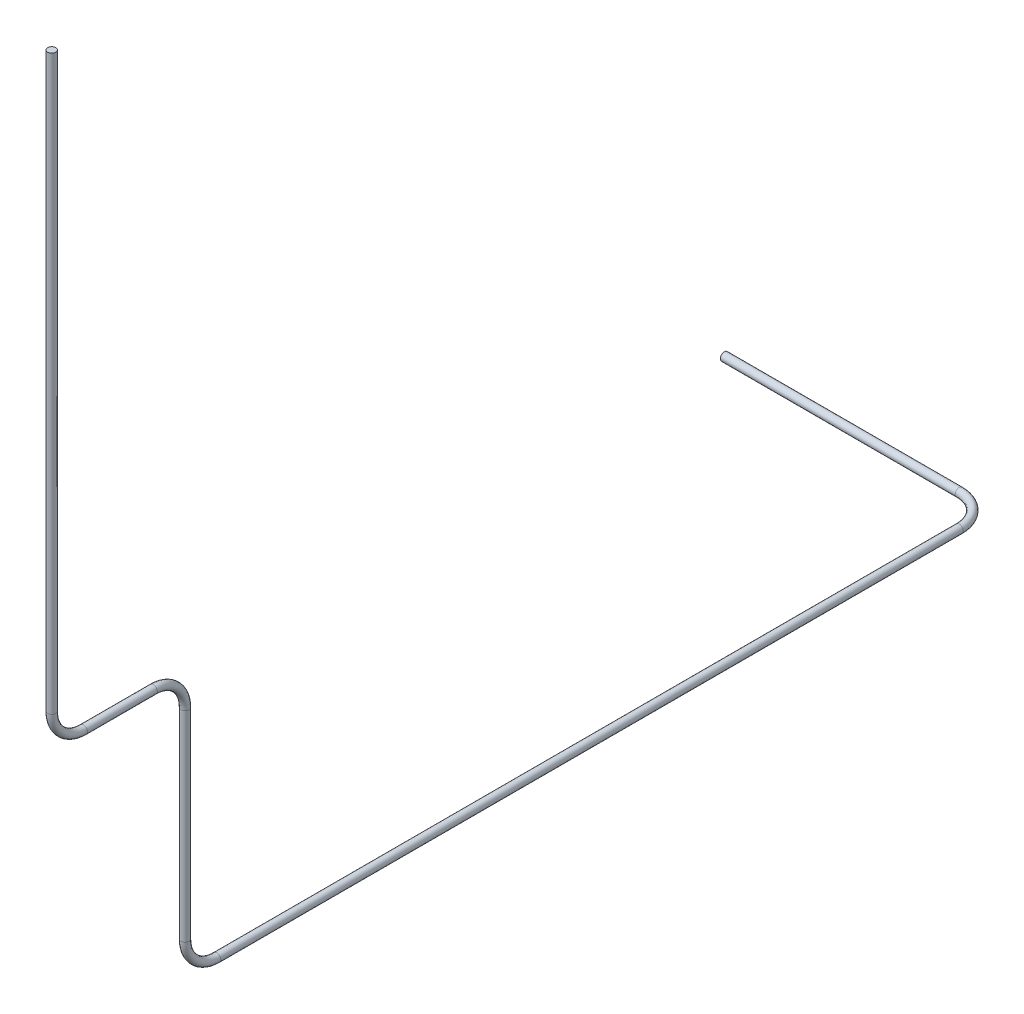
ISO-10303-21;
HEADER;
FILE_DESCRIPTION(('STEP AP214'),'2;1');
FILE_NAME('part.step','',(''),(''),'','','');
FILE_SCHEMA(('AUTOMOTIVE_DESIGN { 1 0 10303 214 1 1 1 1 }'));
ENDSEC;
DATA;
#1=APPLICATION_CONTEXT('core data for automotive mechanical design processes');
#2=APPLICATION_PROTOCOL_DEFINITION('international standard','automotive_design',2000,#1);
#3=PRODUCT_CONTEXT('',#1,'mechanical');
#4=PRODUCT('Part','Part','',(#3));
#5=PRODUCT_RELATED_PRODUCT_CATEGORY('part','',(#4));
#6=PRODUCT_DEFINITION_FORMATION('','',#4);
#7=PRODUCT_DEFINITION_CONTEXT('part definition',#1,'design');
#8=PRODUCT_DEFINITION('design','',#6,#7);
#9=PRODUCT_DEFINITION_SHAPE('','',#8);
#10=(LENGTH_UNIT() NAMED_UNIT(*) SI_UNIT(.MILLI.,.METRE.));
#11=(NAMED_UNIT(*) PLANE_ANGLE_UNIT() SI_UNIT($,.RADIAN.));
#12=(NAMED_UNIT(*) SI_UNIT($,.STERADIAN.) SOLID_ANGLE_UNIT());
#13=UNCERTAINTY_MEASURE_WITH_UNIT(LENGTH_MEASURE(1.E-05),#10,'distance_accuracy_value','');
#14=(GEOMETRIC_REPRESENTATION_CONTEXT(3) GLOBAL_UNCERTAINTY_ASSIGNED_CONTEXT((#13)) GLOBAL_UNIT_ASSIGNED_CONTEXT((#10,
#11,#12)) REPRESENTATION_CONTEXT('',''));
#15=CARTESIAN_POINT('',(0.,0.,0.));
#16=DIRECTION('',(0.,0.,1.));
#17=DIRECTION('',(1.,0.,0.));
#18=AXIS2_PLACEMENT_3D('',#15,#16,#17);
#19=CARTESIAN_POINT('',(656.377216767577,-1278.81069577168,2027.31999999998));
#20=DIRECTION('',(-1.,0.,0.));
#21=DIRECTION('',(0.,1.,0.));
#22=AXIS2_PLACEMENT_3D('',#19,#20,#21);
#23=PLANE('',#22);
#24=CARTESIAN_POINT('',(656.377216767577,-1278.81069577168,2027.31999999998));
#25=DIRECTION('',(-1.,0.,0.));
#26=DIRECTION('',(0.,1.,0.));
#27=AXIS2_PLACEMENT_3D('',#24,#25,#26);
#28=CIRCLE('',#27,6.35000000000008);
#29=CARTESIAN_POINT('',(656.377216767577,-1272.46069577168,2027.31999999998));
#30=VERTEX_POINT('',#29);
#31=EDGE_CURVE('E57',#30,#30,#28,.T.);
#32=ORIENTED_EDGE('',*,*,#31,.T.);
#33=EDGE_LOOP('',(#32));
#34=FACE_BOUND('',#33,.T.);
#35=ADVANCED_FACE('F45',(#34),#23,.T.);
#36=CARTESIAN_POINT('',(1076.37721676758,89.0413856125535,3506.87964633875));
#37=DIRECTION('',(0.,-1.,0.));
#38=DIRECTION('',(0.,0.,-1.));
#39=AXIS2_PLACEMENT_3D('',#36,#37,#38);
#40=PLANE('',#39);
#41=CARTESIAN_POINT('',(1076.37721676758,89.0413856125535,3506.87964633875));
#42=DIRECTION('',(0.,-1.,0.));
#43=DIRECTION('',(0.,0.,-1.));
#44=AXIS2_PLACEMENT_3D('',#41,#42,#43);
#45=CIRCLE('',#44,6.35000000000008);
#46=CARTESIAN_POINT('',(1076.37721676758,89.0413856125535,3500.52964633875));
#47=VERTEX_POINT('',#46);
#48=EDGE_CURVE('E12',#47,#47,#45,.T.);
#49=ORIENTED_EDGE('',*,*,#48,.F.);
#50=EDGE_LOOP('',(#49));
#51=FACE_BOUND('',#50,.T.);
#52=ADVANCED_FACE('F63',(#51),#40,.F.);
#53=CARTESIAN_POINT('',(656.377216767577,-1278.81069577168,2027.31999999998));
#54=DIRECTION('',(1.,0.,0.));
#55=DIRECTION('',(0.,0.,-1.));
#56=AXIS2_PLACEMENT_3D('',#53,#54,#55);
#57=CYLINDRICAL_SURFACE('',#56,6.35000000000008);
#58=CARTESIAN_POINT('',(1026.37721676758,-1278.81069577168,2027.31999999998));
#59=DIRECTION('',(-1.,0.,0.));
#60=DIRECTION('',(0.,1.,0.));
#61=AXIS2_PLACEMENT_3D('',#58,#59,#60);
#62=CIRCLE('',#61,6.35000000000008);
#63=CARTESIAN_POINT('',(1026.37721676758,-1278.81069577168,2020.96999999998));
#64=VERTEX_POINT('',#63);
#65=EDGE_CURVE('E113',#64,#64,#62,.T.);
#66=ORIENTED_EDGE('',*,*,#65,.T.);
#67=EDGE_LOOP('',(#66));
#68=FACE_BOUND('',#67,.T.);
#69=ORIENTED_EDGE('',*,*,#31,.F.);
#70=EDGE_LOOP('',(#69));
#71=FACE_BOUND('',#70,.T.);
#72=ADVANCED_FACE('F65',(#68,#71),#57,.T.);
#73=CARTESIAN_POINT('',(1026.37721676758,-1278.81069577168,2077.31999999998));
#74=DIRECTION('',(0.,-1.,0.));
#75=DIRECTION('',(0.,0.,-1.));
#76=AXIS2_PLACEMENT_3D('',#73,#74,#75);
#77=TOROIDAL_SURFACE('',#76,49.9999999999998,6.35000000000008);
#78=CARTESIAN_POINT('',(1076.37721676758,-1278.81069577168,2077.31999999998));
#79=DIRECTION('',(0.,0.,-1.));
#80=DIRECTION('',(0.,1.,0.));
#81=AXIS2_PLACEMENT_3D('',#78,#79,#80);
#82=CIRCLE('',#81,6.35000000000008);
#83=CARTESIAN_POINT('',(1082.72721676758,-1278.81069577168,2077.31999999998));
#84=VERTEX_POINT('',#83);
#85=EDGE_CURVE('E110',#84,#84,#82,.T.);
#86=CARTESIAN_POINT('',(1026.37721676758,-1278.81069577168,2077.31999999998));
#87=DIRECTION('',(0.,-1.,0.));
#88=DIRECTION('',(0.,0.,-1.));
#89=AXIS2_PLACEMENT_3D('',#86,#87,#88);
#90=CIRCLE('',#89,56.3499999999999);
#91=EDGE_CURVE('',#64,#84,#90,.T.);
#92=ORIENTED_EDGE('',*,*,#65,.F.);
#93=ORIENTED_EDGE('',*,*,#85,.T.);
#94=ORIENTED_EDGE('',*,*,#91,.T.);
#95=ORIENTED_EDGE('',*,*,#91,.F.);
#96=EDGE_LOOP('',(#92,#94,#93,#95));
#97=FACE_BOUND('',#96,.T.);
#98=ADVANCED_FACE('F70',(#97),#77,.T.);
#99=CARTESIAN_POINT('',(1076.37721676758,-1278.81069577168,2077.31999999998));
#100=DIRECTION('',(0.,0.,1.));
#101=DIRECTION('',(1.,0.,0.));
#102=AXIS2_PLACEMENT_3D('',#99,#100,#101);
#103=CYLINDRICAL_SURFACE('',#102,6.35000000000008);
#104=CARTESIAN_POINT('',(1076.37721676758,-1278.81069577168,3246.87964633875));
#105=DIRECTION('',(0.,0.,-1.));
#106=DIRECTION('',(0.,1.,0.));
#107=AXIS2_PLACEMENT_3D('',#104,#105,#106);
#108=CIRCLE('',#107,6.35000000000008);
#109=CARTESIAN_POINT('',(1076.37721676758,-1285.16069577168,3246.87964633875));
#110=VERTEX_POINT('',#109);
#111=EDGE_CURVE('E115',#110,#110,#108,.T.);
#112=ORIENTED_EDGE('',*,*,#111,.T.);
#113=EDGE_LOOP('',(#112));
#114=FACE_BOUND('',#113,.T.);
#115=ORIENTED_EDGE('',*,*,#85,.F.);
#116=EDGE_LOOP('',(#115));
#117=FACE_BOUND('',#116,.T.);
#118=ADVANCED_FACE('F98',(#114,#117),#103,.T.);
#119=CARTESIAN_POINT('',(1076.37721676758,-1228.81069577168,3246.87964633875));
#120=DIRECTION('',(-1.,0.,0.));
#121=DIRECTION('',(0.,0.,1.));
#122=AXIS2_PLACEMENT_3D('',#119,#120,#121);
#123=TOROIDAL_SURFACE('',#122,49.9999999999998,6.35000000000008);
#124=CARTESIAN_POINT('',(1076.37721676758,-1228.81069577168,3296.87964633875));
#125=DIRECTION('',(0.,-1.,0.));
#126=DIRECTION('',(0.,0.,-1.));
#127=AXIS2_PLACEMENT_3D('',#124,#125,#126);
#128=CIRCLE('',#127,6.35000000000008);
#129=CARTESIAN_POINT('',(1076.37721676758,-1228.81069577168,3303.22964633875));
#130=VERTEX_POINT('',#129);
#131=EDGE_CURVE('E121',#130,#130,#128,.T.);
#132=CARTESIAN_POINT('',(1076.37721676758,-1228.81069577168,3246.87964633875));
#133=DIRECTION('',(-1.,0.,0.));
#134=DIRECTION('',(0.,0.,1.));
#135=AXIS2_PLACEMENT_3D('',#132,#133,#134);
#136=CIRCLE('',#135,56.3499999999999);
#137=EDGE_CURVE('',#110,#130,#136,.T.);
#138=ORIENTED_EDGE('',*,*,#111,.F.);
#139=ORIENTED_EDGE('',*,*,#131,.T.);
#140=ORIENTED_EDGE('',*,*,#137,.T.);
#141=ORIENTED_EDGE('',*,*,#137,.F.);
#142=EDGE_LOOP('',(#138,#140,#139,#141));
#143=FACE_BOUND('',#142,.T.);
#144=ADVANCED_FACE('F94',(#143),#123,.T.);
#145=CARTESIAN_POINT('',(1076.37721676758,-1228.81069577168,3296.87964633875));
#146=DIRECTION('',(0.,1.,0.));
#147=DIRECTION('',(0.,0.,1.));
#148=AXIS2_PLACEMENT_3D('',#145,#146,#147);
#149=CYLINDRICAL_SURFACE('',#148,6.35000000000008);
#150=CARTESIAN_POINT('',(1076.37721676758,-912.884720839443,3296.87964633875));
#151=DIRECTION('',(0.,-1.,0.));
#152=DIRECTION('',(0.,0.,-1.));
#153=AXIS2_PLACEMENT_3D('',#150,#151,#152);
#154=CIRCLE('',#153,6.35000000000008);
#155=CARTESIAN_POINT('',(1076.37721676758,-912.884720839443,3290.52964633875));
#156=VERTEX_POINT('',#155);
#157=EDGE_CURVE('E124',#156,#156,#154,.T.);
#158=ORIENTED_EDGE('',*,*,#157,.T.);
#159=EDGE_LOOP('',(#158));
#160=FACE_BOUND('',#159,.T.);
#161=ORIENTED_EDGE('',*,*,#131,.F.);
#162=EDGE_LOOP('',(#161));
#163=FACE_BOUND('',#162,.T.);
#164=ADVANCED_FACE('F90',(#160,#163),#149,.T.);
#165=CARTESIAN_POINT('',(1076.37721676758,-912.884720839443,3346.87964633875));
#166=DIRECTION('',(1.,0.,0.));
#167=DIRECTION('',(0.,0.,-1.));
#168=AXIS2_PLACEMENT_3D('',#165,#166,#167);
#169=TOROIDAL_SURFACE('',#168,49.9999999999998,6.35000000000008);
#170=CARTESIAN_POINT('',(1076.37721676758,-862.884720839444,3346.87964633875));
#171=DIRECTION('',(0.,0.,-1.));
#172=DIRECTION('',(0.,1.,0.));
#173=AXIS2_PLACEMENT_3D('',#170,#171,#172);
#174=CIRCLE('',#173,6.35000000000008);
#175=CARTESIAN_POINT('',(1076.37721676758,-856.534720839443,3346.87964633875));
#176=VERTEX_POINT('',#175);
#177=EDGE_CURVE('E127',#176,#176,#174,.T.);
#178=CARTESIAN_POINT('',(1076.37721676758,-912.884720839443,3346.87964633875));
#179=DIRECTION('',(1.,0.,0.));
#180=DIRECTION('',(0.,0.,-1.));
#181=AXIS2_PLACEMENT_3D('',#178,#179,#180);
#182=CIRCLE('',#181,56.3499999999999);
#183=EDGE_CURVE('',#156,#176,#182,.T.);
#184=ORIENTED_EDGE('',*,*,#157,.F.);
#185=ORIENTED_EDGE('',*,*,#177,.T.);
#186=ORIENTED_EDGE('',*,*,#183,.T.);
#187=ORIENTED_EDGE('',*,*,#183,.F.);
#188=EDGE_LOOP('',(#184,#186,#185,#187));
#189=FACE_BOUND('',#188,.T.);
#190=ADVANCED_FACE('F86',(#189),#169,.T.);
#191=CARTESIAN_POINT('',(1076.37721676758,-862.884720839444,3346.87964633875));
#192=DIRECTION('',(0.,0.,1.));
#193=DIRECTION('',(1.,0.,0.));
#194=AXIS2_PLACEMENT_3D('',#191,#192,#193);
#195=CYLINDRICAL_SURFACE('',#194,6.35000000000008);
#196=CARTESIAN_POINT('',(1076.37721676758,-862.884720839444,3456.87964633875));
#197=DIRECTION('',(0.,0.,-1.));
#198=DIRECTION('',(0.,1.,0.));
#199=AXIS2_PLACEMENT_3D('',#196,#197,#198);
#200=CIRCLE('',#199,6.35000000000008);
#201=CARTESIAN_POINT('',(1076.37721676758,-869.234720839444,3456.87964633875));
#202=VERTEX_POINT('',#201);
#203=EDGE_CURVE('E130',#202,#202,#200,.T.);
#204=ORIENTED_EDGE('',*,*,#203,.T.);
#205=EDGE_LOOP('',(#204));
#206=FACE_BOUND('',#205,.T.);
#207=ORIENTED_EDGE('',*,*,#177,.F.);
#208=EDGE_LOOP('',(#207));
#209=FACE_BOUND('',#208,.T.);
#210=ADVANCED_FACE('F80',(#206,#209),#195,.T.);
#211=CARTESIAN_POINT('',(1076.37721676758,-812.884720839443,3456.87964633875));
#212=DIRECTION('',(-1.,0.,0.));
#213=DIRECTION('',(0.,0.,1.));
#214=AXIS2_PLACEMENT_3D('',#211,#212,#213);
#215=TOROIDAL_SURFACE('',#214,50.0000000000002,6.35000000000008);
#216=CARTESIAN_POINT('',(1076.37721676758,-812.884720839443,3506.87964633875));
#217=DIRECTION('',(0.,-1.,0.));
#218=DIRECTION('',(0.,0.,-1.));
#219=AXIS2_PLACEMENT_3D('',#216,#217,#218);
#220=CIRCLE('',#219,6.35000000000008);
#221=CARTESIAN_POINT('',(1076.37721676758,-812.884720839443,3513.22964633875));
#222=VERTEX_POINT('',#221);
#223=EDGE_CURVE('E52',#222,#222,#220,.T.);
#224=CARTESIAN_POINT('',(1076.37721676758,-812.884720839443,3456.87964633875));
#225=DIRECTION('',(-1.,0.,0.));
#226=DIRECTION('',(0.,0.,1.));
#227=AXIS2_PLACEMENT_3D('',#224,#225,#226);
#228=CIRCLE('',#227,56.3500000000002);
#229=EDGE_CURVE('',#202,#222,#228,.T.);
#230=ORIENTED_EDGE('',*,*,#203,.F.);
#231=ORIENTED_EDGE('',*,*,#223,.T.);
#232=ORIENTED_EDGE('',*,*,#229,.T.);
#233=ORIENTED_EDGE('',*,*,#229,.F.);
#234=EDGE_LOOP('',(#230,#232,#231,#233));
#235=FACE_BOUND('',#234,.T.);
#236=ADVANCED_FACE('F76',(#235),#215,.T.);
#237=CARTESIAN_POINT('',(1076.37721676758,-812.884720839443,3506.87964633875));
#238=DIRECTION('',(0.,1.,0.));
#239=DIRECTION('',(0.,0.,1.));
#240=AXIS2_PLACEMENT_3D('',#237,#238,#239);
#241=CYLINDRICAL_SURFACE('',#240,6.35000000000008);
#242=ORIENTED_EDGE('',*,*,#48,.T.);
#243=EDGE_LOOP('',(#242));
#244=FACE_BOUND('',#243,.T.);
#245=ORIENTED_EDGE('',*,*,#223,.F.);
#246=EDGE_LOOP('',(#245));
#247=FACE_BOUND('',#246,.T.);
#248=ADVANCED_FACE('F60',(#244,#247),#241,.T.);
#249=CLOSED_SHELL('',(#35,#52,#72,#98,#118,#144,#164,#190,#210,#236,#248));
#250=MANIFOLD_SOLID_BREP('B2',#249);
#251=ADVANCED_BREP_SHAPE_REPRESENTATION('',(#18,#250),#14);
#252=SHAPE_DEFINITION_REPRESENTATION(#9,#251);
ENDSEC;
END-ISO-10303-21;
